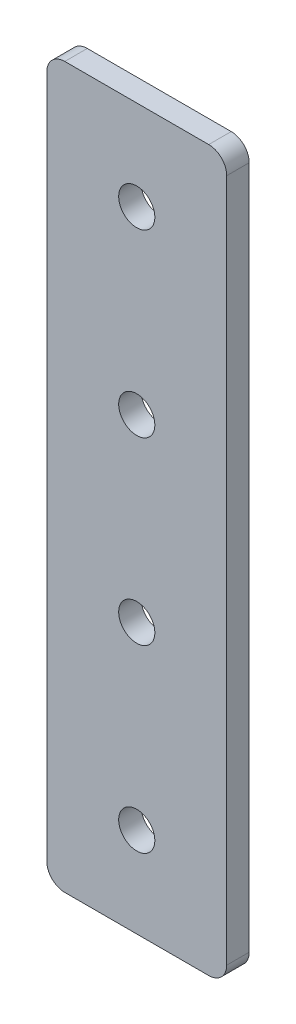
ISO-10303-21;
HEADER;
FILE_DESCRIPTION(('STEP AP214'),'2;1');
FILE_NAME('part.step','',(''),(''),'','','');
FILE_SCHEMA(('AUTOMOTIVE_DESIGN { 1 0 10303 214 1 1 1 1 }'));
ENDSEC;
DATA;
#1=APPLICATION_CONTEXT('core data for automotive mechanical design processes');
#2=APPLICATION_PROTOCOL_DEFINITION('international standard','automotive_design',2000,#1);
#3=PRODUCT_CONTEXT('',#1,'mechanical');
#4=PRODUCT('Part','Part','',(#3));
#5=PRODUCT_RELATED_PRODUCT_CATEGORY('part','',(#4));
#6=PRODUCT_DEFINITION_FORMATION('','',#4);
#7=PRODUCT_DEFINITION_CONTEXT('part definition',#1,'design');
#8=PRODUCT_DEFINITION('design','',#6,#7);
#9=PRODUCT_DEFINITION_SHAPE('','',#8);
#10=(LENGTH_UNIT() NAMED_UNIT(*) SI_UNIT(.MILLI.,.METRE.));
#11=(NAMED_UNIT(*) PLANE_ANGLE_UNIT() SI_UNIT($,.RADIAN.));
#12=(NAMED_UNIT(*) SI_UNIT($,.STERADIAN.) SOLID_ANGLE_UNIT());
#13=UNCERTAINTY_MEASURE_WITH_UNIT(LENGTH_MEASURE(1.E-05),#10,'distance_accuracy_value','');
#14=(GEOMETRIC_REPRESENTATION_CONTEXT(3) GLOBAL_UNCERTAINTY_ASSIGNED_CONTEXT((#13)) GLOBAL_UNIT_ASSIGNED_CONTEXT((#10,
#11,#12)) REPRESENTATION_CONTEXT('',''));
#15=CARTESIAN_POINT('',(0.,0.,0.));
#16=DIRECTION('',(0.,0.,1.));
#17=DIRECTION('',(1.,0.,0.));
#18=AXIS2_PLACEMENT_3D('',#15,#16,#17);
#19=CARTESIAN_POINT('',(0.,0.,3.175));
#20=DIRECTION('',(0.,0.,1.));
#21=DIRECTION('',(1.,0.,0.));
#22=AXIS2_PLACEMENT_3D('',#19,#20,#21);
#23=PLANE('',#22);
#24=CARTESIAN_POINT('',(-12.7,12.7,3.175));
#25=DIRECTION('',(0.,0.,1.));
#26=DIRECTION('',(1.,0.,0.));
#27=AXIS2_PLACEMENT_3D('',#24,#25,#26);
#28=CIRCLE('',#27,2.5527);
#29=CARTESIAN_POINT('',(-10.1473,12.7,3.175));
#30=VERTEX_POINT('',#29);
#31=EDGE_CURVE('E224',#30,#30,#28,.T.);
#32=ORIENTED_EDGE('',*,*,#31,.F.);
#33=EDGE_LOOP('',(#32));
#34=FACE_BOUND('',#33,.T.);
#35=CARTESIAN_POINT('',(-12.7,88.9,3.175));
#36=DIRECTION('',(0.,0.,1.));
#37=DIRECTION('',(1.,0.,0.));
#38=AXIS2_PLACEMENT_3D('',#35,#36,#37);
#39=CIRCLE('',#38,2.5527);
#40=CARTESIAN_POINT('',(-10.1473,88.9,3.175));
#41=VERTEX_POINT('',#40);
#42=EDGE_CURVE('E139',#41,#41,#39,.T.);
#43=ORIENTED_EDGE('',*,*,#42,.F.);
#44=EDGE_LOOP('',(#43));
#45=FACE_BOUND('',#44,.T.);
#46=DIRECTION('',(1.,0.,0.));
#47=VECTOR('',#46,1.);
#48=CARTESIAN_POINT('',(0.,0.,3.175));
#49=LINE('',#48,#47);
#50=CARTESIAN_POINT('',(-22.86,0.,3.175));
#51=VERTEX_POINT('',#50);
#52=CARTESIAN_POINT('',(-2.54,0.,3.175));
#53=VERTEX_POINT('',#52);
#54=EDGE_CURVE('E150',#51,#53,#49,.T.);
#55=ORIENTED_EDGE('',*,*,#54,.T.);
#56=CARTESIAN_POINT('',(-2.54,2.54,3.175));
#57=DIRECTION('',(0.,0.,1.));
#58=DIRECTION('',(1.,0.,0.));
#59=AXIS2_PLACEMENT_3D('',#56,#57,#58);
#60=CIRCLE('',#59,2.54);
#61=CARTESIAN_POINT('',(0.,2.54,3.175));
#62=VERTEX_POINT('',#61);
#63=EDGE_CURVE('E179',#53,#62,#60,.T.);
#64=ORIENTED_EDGE('',*,*,#63,.T.);
#65=DIRECTION('',(0.,1.,0.));
#66=VECTOR('',#65,1.);
#67=CARTESIAN_POINT('',(0.,0.,3.175));
#68=LINE('',#67,#66);
#69=CARTESIAN_POINT('',(0.,99.06,3.175));
#70=VERTEX_POINT('',#69);
#71=EDGE_CURVE('E128',#62,#70,#68,.T.);
#72=ORIENTED_EDGE('',*,*,#71,.T.);
#73=CARTESIAN_POINT('',(-2.54,99.06,3.175));
#74=DIRECTION('',(0.,0.,1.));
#75=DIRECTION('',(1.,0.,0.));
#76=AXIS2_PLACEMENT_3D('',#73,#74,#75);
#77=CIRCLE('',#76,2.54);
#78=CARTESIAN_POINT('',(-2.54,101.6,3.175));
#79=VERTEX_POINT('',#78);
#80=EDGE_CURVE('E173',#70,#79,#77,.T.);
#81=ORIENTED_EDGE('',*,*,#80,.T.);
#82=DIRECTION('',(-1.,0.,0.));
#83=VECTOR('',#82,1.);
#84=CARTESIAN_POINT('',(0.,101.6,3.175));
#85=LINE('',#84,#83);
#86=CARTESIAN_POINT('',(-22.86,101.6,3.175));
#87=VERTEX_POINT('',#86);
#88=EDGE_CURVE('E192',#79,#87,#85,.T.);
#89=ORIENTED_EDGE('',*,*,#88,.T.);
#90=CARTESIAN_POINT('',(-22.86,99.06,3.175));
#91=DIRECTION('',(0.,0.,1.));
#92=DIRECTION('',(1.,0.,0.));
#93=AXIS2_PLACEMENT_3D('',#90,#91,#92);
#94=CIRCLE('',#93,2.54);
#95=CARTESIAN_POINT('',(-25.4,99.06,3.175));
#96=VERTEX_POINT('',#95);
#97=EDGE_CURVE('E62',#87,#96,#94,.T.);
#98=ORIENTED_EDGE('',*,*,#97,.T.);
#99=DIRECTION('',(0.,-1.,0.));
#100=VECTOR('',#99,1.);
#101=CARTESIAN_POINT('',(-25.4,0.,3.175));
#102=LINE('',#101,#100);
#103=CARTESIAN_POINT('',(-25.4,2.54,3.175));
#104=VERTEX_POINT('',#103);
#105=EDGE_CURVE('E199',#96,#104,#102,.T.);
#106=ORIENTED_EDGE('',*,*,#105,.T.);
#107=CARTESIAN_POINT('',(-22.86,2.54,3.175));
#108=DIRECTION('',(0.,0.,1.));
#109=DIRECTION('',(1.,0.,0.));
#110=AXIS2_PLACEMENT_3D('',#107,#108,#109);
#111=CIRCLE('',#110,2.54);
#112=EDGE_CURVE('E176',#104,#51,#111,.T.);
#113=ORIENTED_EDGE('',*,*,#112,.T.);
#114=EDGE_LOOP('',(#55,#64,#72,#81,#89,#98,#106,#113));
#115=FACE_BOUND('',#114,.T.);
#116=CARTESIAN_POINT('',(-12.7,38.1,3.175));
#117=DIRECTION('',(0.,0.,1.));
#118=DIRECTION('',(1.,0.,0.));
#119=AXIS2_PLACEMENT_3D('',#116,#117,#118);
#120=CIRCLE('',#119,2.5527);
#121=CARTESIAN_POINT('',(-10.1473,38.1,3.175));
#122=VERTEX_POINT('',#121);
#123=EDGE_CURVE('E218',#122,#122,#120,.T.);
#124=ORIENTED_EDGE('',*,*,#123,.F.);
#125=EDGE_LOOP('',(#124));
#126=FACE_BOUND('',#125,.T.);
#127=CARTESIAN_POINT('',(-12.7,63.5,3.175));
#128=DIRECTION('',(0.,0.,1.));
#129=DIRECTION('',(1.,0.,0.));
#130=AXIS2_PLACEMENT_3D('',#127,#128,#129);
#131=CIRCLE('',#130,2.5527);
#132=CARTESIAN_POINT('',(-10.1473,63.5,3.175));
#133=VERTEX_POINT('',#132);
#134=EDGE_CURVE('E232',#133,#133,#131,.T.);
#135=ORIENTED_EDGE('',*,*,#134,.F.);
#136=EDGE_LOOP('',(#135));
#137=FACE_BOUND('',#136,.T.);
#138=ADVANCED_FACE('F39',(#34,#45,#115,#126,#137),#23,.T.);
#139=CARTESIAN_POINT('',(0.,0.,0.));
#140=DIRECTION('',(0.,0.,1.));
#141=DIRECTION('',(1.,0.,0.));
#142=AXIS2_PLACEMENT_3D('',#139,#140,#141);
#143=PLANE('',#142);
#144=DIRECTION('',(0.,1.,0.));
#145=VECTOR('',#144,1.);
#146=CARTESIAN_POINT('',(0.,0.,0.));
#147=LINE('',#146,#145);
#148=CARTESIAN_POINT('',(0.,2.54,0.));
#149=VERTEX_POINT('',#148);
#150=CARTESIAN_POINT('',(0.,99.06,0.));
#151=VERTEX_POINT('',#150);
#152=EDGE_CURVE('E125',#149,#151,#147,.T.);
#153=ORIENTED_EDGE('',*,*,#152,.F.);
#154=CARTESIAN_POINT('',(-2.54,2.54,0.));
#155=DIRECTION('',(0.,0.,1.));
#156=DIRECTION('',(1.,0.,0.));
#157=AXIS2_PLACEMENT_3D('',#154,#155,#156);
#158=CIRCLE('',#157,2.54);
#159=CARTESIAN_POINT('',(-2.54,0.,0.));
#160=VERTEX_POINT('',#159);
#161=EDGE_CURVE('E107',#149,#160,#158,.F.);
#162=ORIENTED_EDGE('',*,*,#161,.T.);
#163=DIRECTION('',(1.,0.,0.));
#164=VECTOR('',#163,1.);
#165=CARTESIAN_POINT('',(0.,0.,0.));
#166=LINE('',#165,#164);
#167=CARTESIAN_POINT('',(-22.86,0.,0.));
#168=VERTEX_POINT('',#167);
#169=EDGE_CURVE('E155',#168,#160,#166,.T.);
#170=ORIENTED_EDGE('',*,*,#169,.F.);
#171=CARTESIAN_POINT('',(-22.86,2.54,0.));
#172=DIRECTION('',(0.,0.,1.));
#173=DIRECTION('',(1.,0.,0.));
#174=AXIS2_PLACEMENT_3D('',#171,#172,#173);
#175=CIRCLE('',#174,2.54);
#176=CARTESIAN_POINT('',(-25.4,2.54,0.));
#177=VERTEX_POINT('',#176);
#178=EDGE_CURVE('E119',#168,#177,#175,.F.);
#179=ORIENTED_EDGE('',*,*,#178,.T.);
#180=DIRECTION('',(0.,-1.,0.));
#181=VECTOR('',#180,1.);
#182=CARTESIAN_POINT('',(-25.4,0.,0.));
#183=LINE('',#182,#181);
#184=CARTESIAN_POINT('',(-25.4,99.06,0.));
#185=VERTEX_POINT('',#184);
#186=EDGE_CURVE('E144',#185,#177,#183,.T.);
#187=ORIENTED_EDGE('',*,*,#186,.F.);
#188=CARTESIAN_POINT('',(-22.86,99.06,0.));
#189=DIRECTION('',(0.,0.,1.));
#190=DIRECTION('',(1.,0.,0.));
#191=AXIS2_PLACEMENT_3D('',#188,#189,#190);
#192=CIRCLE('',#191,2.54);
#193=CARTESIAN_POINT('',(-22.86,101.6,0.));
#194=VERTEX_POINT('',#193);
#195=EDGE_CURVE('E130',#185,#194,#192,.F.);
#196=ORIENTED_EDGE('',*,*,#195,.T.);
#197=DIRECTION('',(-1.,0.,0.));
#198=VECTOR('',#197,1.);
#199=CARTESIAN_POINT('',(0.,101.6,0.));
#200=LINE('',#199,#198);
#201=CARTESIAN_POINT('',(-2.54,101.6,0.));
#202=VERTEX_POINT('',#201);
#203=EDGE_CURVE('E138',#202,#194,#200,.T.);
#204=ORIENTED_EDGE('',*,*,#203,.F.);
#205=CARTESIAN_POINT('',(-2.54,99.06,0.));
#206=DIRECTION('',(0.,0.,1.));
#207=DIRECTION('',(1.,0.,0.));
#208=AXIS2_PLACEMENT_3D('',#205,#206,#207);
#209=CIRCLE('',#208,2.54);
#210=EDGE_CURVE('E136',#202,#151,#209,.F.);
#211=ORIENTED_EDGE('',*,*,#210,.T.);
#212=EDGE_LOOP('',(#153,#162,#170,#179,#187,#196,#204,#211));
#213=FACE_BOUND('',#212,.T.);
#214=CARTESIAN_POINT('',(-12.7,88.9,0.));
#215=DIRECTION('',(0.,0.,1.));
#216=DIRECTION('',(1.,0.,0.));
#217=AXIS2_PLACEMENT_3D('',#214,#215,#216);
#218=CIRCLE('',#217,2.5527);
#219=CARTESIAN_POINT('',(-10.1473,88.9,0.));
#220=VERTEX_POINT('',#219);
#221=EDGE_CURVE('E147',#220,#220,#218,.T.);
#222=ORIENTED_EDGE('',*,*,#221,.T.);
#223=EDGE_LOOP('',(#222));
#224=FACE_BOUND('',#223,.T.);
#225=CARTESIAN_POINT('',(-12.7,38.1,0.));
#226=DIRECTION('',(0.,0.,1.));
#227=DIRECTION('',(1.,0.,0.));
#228=AXIS2_PLACEMENT_3D('',#225,#226,#227);
#229=CIRCLE('',#228,2.5527);
#230=CARTESIAN_POINT('',(-10.1473,38.1,0.));
#231=VERTEX_POINT('',#230);
#232=EDGE_CURVE('E220',#231,#231,#229,.T.);
#233=ORIENTED_EDGE('',*,*,#232,.T.);
#234=EDGE_LOOP('',(#233));
#235=FACE_BOUND('',#234,.T.);
#236=CARTESIAN_POINT('',(-12.7,12.7,0.));
#237=DIRECTION('',(0.,0.,1.));
#238=DIRECTION('',(1.,0.,0.));
#239=AXIS2_PLACEMENT_3D('',#236,#237,#238);
#240=CIRCLE('',#239,2.5527);
#241=CARTESIAN_POINT('',(-10.1473,12.7,0.));
#242=VERTEX_POINT('',#241);
#243=EDGE_CURVE('E228',#242,#242,#240,.T.);
#244=ORIENTED_EDGE('',*,*,#243,.T.);
#245=EDGE_LOOP('',(#244));
#246=FACE_BOUND('',#245,.T.);
#247=CARTESIAN_POINT('',(-12.7,63.5,0.));
#248=DIRECTION('',(0.,0.,1.));
#249=DIRECTION('',(1.,0.,0.));
#250=AXIS2_PLACEMENT_3D('',#247,#248,#249);
#251=CIRCLE('',#250,2.5527);
#252=CARTESIAN_POINT('',(-10.1473,63.5,0.));
#253=VERTEX_POINT('',#252);
#254=EDGE_CURVE('E236',#253,#253,#251,.T.);
#255=ORIENTED_EDGE('',*,*,#254,.T.);
#256=EDGE_LOOP('',(#255));
#257=FACE_BOUND('',#256,.T.);
#258=ADVANCED_FACE('F133',(#213,#224,#235,#246,#257),#143,.F.);
#259=CARTESIAN_POINT('',(0.,0.,3.175));
#260=DIRECTION('',(-1.,0.,0.));
#261=DIRECTION('',(0.,0.,1.));
#262=AXIS2_PLACEMENT_3D('',#259,#260,#261);
#263=PLANE('',#262);
#264=ORIENTED_EDGE('',*,*,#71,.F.);
#265=DIRECTION('',(0.,0.,-1.));
#266=VECTOR('',#265,1.);
#267=CARTESIAN_POINT('',(0.,2.54,3.175));
#268=LINE('',#267,#266);
#269=EDGE_CURVE('E111',#62,#149,#268,.T.);
#270=ORIENTED_EDGE('',*,*,#269,.T.);
#271=ORIENTED_EDGE('',*,*,#152,.T.);
#272=DIRECTION('',(0.,0.,-1.));
#273=VECTOR('',#272,1.);
#274=CARTESIAN_POINT('',(0.,99.06,3.175));
#275=LINE('',#274,#273);
#276=EDGE_CURVE('E131',#151,#70,#275,.F.);
#277=ORIENTED_EDGE('',*,*,#276,.T.);
#278=EDGE_LOOP('',(#264,#270,#271,#277));
#279=FACE_BOUND('',#278,.T.);
#280=ADVANCED_FACE('F124',(#279),#263,.F.);
#281=CARTESIAN_POINT('',(0.,101.6,3.175));
#282=DIRECTION('',(0.,-1.,0.));
#283=DIRECTION('',(0.,0.,-1.));
#284=AXIS2_PLACEMENT_3D('',#281,#282,#283);
#285=PLANE('',#284);
#286=ORIENTED_EDGE('',*,*,#88,.F.);
#287=DIRECTION('',(0.,0.,-1.));
#288=VECTOR('',#287,1.);
#289=CARTESIAN_POINT('',(-2.54,101.6,3.175));
#290=LINE('',#289,#288);
#291=EDGE_CURVE('E11',#79,#202,#290,.T.);
#292=ORIENTED_EDGE('',*,*,#291,.T.);
#293=ORIENTED_EDGE('',*,*,#203,.T.);
#294=DIRECTION('',(0.,0.,-1.));
#295=VECTOR('',#294,1.);
#296=CARTESIAN_POINT('',(-22.86,101.6,3.175));
#297=LINE('',#296,#295);
#298=EDGE_CURVE('E48',#194,#87,#297,.F.);
#299=ORIENTED_EDGE('',*,*,#298,.T.);
#300=EDGE_LOOP('',(#286,#292,#293,#299));
#301=FACE_BOUND('',#300,.T.);
#302=ADVANCED_FACE('F191',(#301),#285,.F.);
#303=CARTESIAN_POINT('',(-25.4,0.,3.175));
#304=DIRECTION('',(1.,0.,0.));
#305=DIRECTION('',(0.,0.,-1.));
#306=AXIS2_PLACEMENT_3D('',#303,#304,#305);
#307=PLANE('',#306);
#308=ORIENTED_EDGE('',*,*,#186,.T.);
#309=DIRECTION('',(0.,0.,-1.));
#310=VECTOR('',#309,1.);
#311=CARTESIAN_POINT('',(-25.4,2.54,3.175));
#312=LINE('',#311,#310);
#313=EDGE_CURVE('E55',#177,#104,#312,.F.);
#314=ORIENTED_EDGE('',*,*,#313,.T.);
#315=ORIENTED_EDGE('',*,*,#105,.F.);
#316=DIRECTION('',(0.,0.,-1.));
#317=VECTOR('',#316,1.);
#318=CARTESIAN_POINT('',(-25.4,99.06,3.175));
#319=LINE('',#318,#317);
#320=EDGE_CURVE('E182',#96,#185,#319,.T.);
#321=ORIENTED_EDGE('',*,*,#320,.T.);
#322=EDGE_LOOP('',(#308,#314,#315,#321));
#323=FACE_BOUND('',#322,.T.);
#324=ADVANCED_FACE('F203',(#323),#307,.F.);
#325=CARTESIAN_POINT('',(0.,0.,3.175));
#326=DIRECTION('',(0.,1.,0.));
#327=DIRECTION('',(-1.,0.,0.));
#328=AXIS2_PLACEMENT_3D('',#325,#326,#327);
#329=PLANE('',#328);
#330=ORIENTED_EDGE('',*,*,#169,.T.);
#331=DIRECTION('',(0.,0.,-1.));
#332=VECTOR('',#331,1.);
#333=CARTESIAN_POINT('',(-2.54,0.,3.175));
#334=LINE('',#333,#332);
#335=EDGE_CURVE('E112',#160,#53,#334,.F.);
#336=ORIENTED_EDGE('',*,*,#335,.T.);
#337=ORIENTED_EDGE('',*,*,#54,.F.);
#338=DIRECTION('',(0.,0.,-1.));
#339=VECTOR('',#338,1.);
#340=CARTESIAN_POINT('',(-22.86,0.,3.175));
#341=LINE('',#340,#339);
#342=EDGE_CURVE('E118',#51,#168,#341,.T.);
#343=ORIENTED_EDGE('',*,*,#342,.T.);
#344=EDGE_LOOP('',(#330,#336,#337,#343));
#345=FACE_BOUND('',#344,.T.);
#346=ADVANCED_FACE('F210',(#345),#329,.F.);
#347=CARTESIAN_POINT('',(-12.7,88.9,3.175));
#348=DIRECTION('',(0.,0.,-1.));
#349=DIRECTION('',(-1.,0.,0.));
#350=AXIS2_PLACEMENT_3D('',#347,#348,#349);
#351=CYLINDRICAL_SURFACE('',#350,2.5527);
#352=ORIENTED_EDGE('',*,*,#42,.T.);
#353=EDGE_LOOP('',(#352));
#354=FACE_BOUND('',#353,.T.);
#355=ORIENTED_EDGE('',*,*,#221,.F.);
#356=EDGE_LOOP('',(#355));
#357=FACE_BOUND('',#356,.T.);
#358=ADVANCED_FACE('F257',(#354,#357),#351,.F.);
#359=CARTESIAN_POINT('',(-12.7,38.1,3.175));
#360=DIRECTION('',(0.,0.,-1.));
#361=DIRECTION('',(-1.,0.,0.));
#362=AXIS2_PLACEMENT_3D('',#359,#360,#361);
#363=CYLINDRICAL_SURFACE('',#362,2.5527);
#364=ORIENTED_EDGE('',*,*,#123,.T.);
#365=EDGE_LOOP('',(#364));
#366=FACE_BOUND('',#365,.T.);
#367=ORIENTED_EDGE('',*,*,#232,.F.);
#368=EDGE_LOOP('',(#367));
#369=FACE_BOUND('',#368,.T.);
#370=ADVANCED_FACE('F349',(#366,#369),#363,.F.);
#371=CARTESIAN_POINT('',(-12.7,12.7,3.175));
#372=DIRECTION('',(0.,0.,-1.));
#373=DIRECTION('',(-1.,0.,0.));
#374=AXIS2_PLACEMENT_3D('',#371,#372,#373);
#375=CYLINDRICAL_SURFACE('',#374,2.5527);
#376=ORIENTED_EDGE('',*,*,#31,.T.);
#377=EDGE_LOOP('',(#376));
#378=FACE_BOUND('',#377,.T.);
#379=ORIENTED_EDGE('',*,*,#243,.F.);
#380=EDGE_LOOP('',(#379));
#381=FACE_BOUND('',#380,.T.);
#382=ADVANCED_FACE('F340',(#378,#381),#375,.F.);
#383=CARTESIAN_POINT('',(-12.7,63.5,3.175));
#384=DIRECTION('',(0.,0.,-1.));
#385=DIRECTION('',(-1.,0.,0.));
#386=AXIS2_PLACEMENT_3D('',#383,#384,#385);
#387=CYLINDRICAL_SURFACE('',#386,2.5527);
#388=ORIENTED_EDGE('',*,*,#134,.T.);
#389=EDGE_LOOP('',(#388));
#390=FACE_BOUND('',#389,.T.);
#391=ORIENTED_EDGE('',*,*,#254,.F.);
#392=EDGE_LOOP('',(#391));
#393=FACE_BOUND('',#392,.T.);
#394=ADVANCED_FACE('F244',(#390,#393),#387,.F.);
#395=CARTESIAN_POINT('',(-2.54,2.54,3.175));
#396=DIRECTION('',(0.,0.,-1.));
#397=DIRECTION('',(-1.,0.,0.));
#398=AXIS2_PLACEMENT_3D('',#395,#396,#397);
#399=CYLINDRICAL_SURFACE('',#398,2.54);
#400=ORIENTED_EDGE('',*,*,#63,.F.);
#401=ORIENTED_EDGE('',*,*,#335,.F.);
#402=ORIENTED_EDGE('',*,*,#161,.F.);
#403=ORIENTED_EDGE('',*,*,#269,.F.);
#404=EDGE_LOOP('',(#400,#401,#402,#403));
#405=FACE_BOUND('',#404,.T.);
#406=ADVANCED_FACE('F110',(#405),#399,.T.);
#407=CARTESIAN_POINT('',(-22.86,2.54,3.175));
#408=DIRECTION('',(0.,0.,-1.));
#409=DIRECTION('',(-1.,0.,0.));
#410=AXIS2_PLACEMENT_3D('',#407,#408,#409);
#411=CYLINDRICAL_SURFACE('',#410,2.54);
#412=ORIENTED_EDGE('',*,*,#112,.F.);
#413=ORIENTED_EDGE('',*,*,#313,.F.);
#414=ORIENTED_EDGE('',*,*,#178,.F.);
#415=ORIENTED_EDGE('',*,*,#342,.F.);
#416=EDGE_LOOP('',(#412,#413,#414,#415));
#417=FACE_BOUND('',#416,.T.);
#418=ADVANCED_FACE('F207',(#417),#411,.T.);
#419=CARTESIAN_POINT('',(-2.54,99.06,3.175));
#420=DIRECTION('',(0.,0.,-1.));
#421=DIRECTION('',(-1.,0.,0.));
#422=AXIS2_PLACEMENT_3D('',#419,#420,#421);
#423=CYLINDRICAL_SURFACE('',#422,2.54);
#424=ORIENTED_EDGE('',*,*,#80,.F.);
#425=ORIENTED_EDGE('',*,*,#276,.F.);
#426=ORIENTED_EDGE('',*,*,#210,.F.);
#427=ORIENTED_EDGE('',*,*,#291,.F.);
#428=EDGE_LOOP('',(#424,#425,#426,#427));
#429=FACE_BOUND('',#428,.T.);
#430=ADVANCED_FACE('F271',(#429),#423,.T.);
#431=CARTESIAN_POINT('',(-22.86,99.06,3.175));
#432=DIRECTION('',(0.,0.,-1.));
#433=DIRECTION('',(-1.,0.,0.));
#434=AXIS2_PLACEMENT_3D('',#431,#432,#433);
#435=CYLINDRICAL_SURFACE('',#434,2.54);
#436=ORIENTED_EDGE('',*,*,#97,.F.);
#437=ORIENTED_EDGE('',*,*,#298,.F.);
#438=ORIENTED_EDGE('',*,*,#195,.F.);
#439=ORIENTED_EDGE('',*,*,#320,.F.);
#440=EDGE_LOOP('',(#436,#437,#438,#439));
#441=FACE_BOUND('',#440,.T.);
#442=ADVANCED_FACE('F41',(#441),#435,.T.);
#443=CLOSED_SHELL('',(#138,#258,#280,#302,#324,#346,#358,#370,#382,#394,#406,#418,#430,#442));
#444=MANIFOLD_SOLID_BREP('B2',#443);
#445=ADVANCED_BREP_SHAPE_REPRESENTATION('',(#18,#444),#14);
#446=SHAPE_DEFINITION_REPRESENTATION(#9,#445);
ENDSEC;
END-ISO-10303-21;
